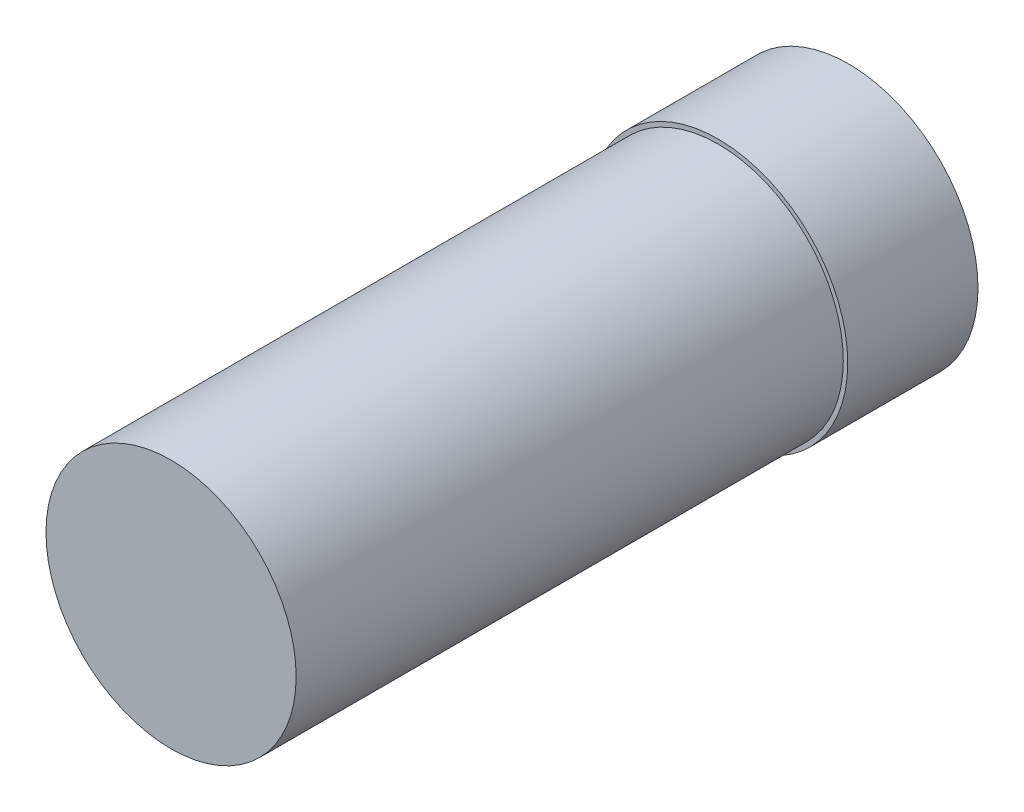
ISO-10303-21;
HEADER;
FILE_DESCRIPTION(('STEP AP214'),'2;1');
FILE_NAME('part.step','',(''),(''),'','','');
FILE_SCHEMA(('AUTOMOTIVE_DESIGN { 1 0 10303 214 1 1 1 1 }'));
ENDSEC;
DATA;
#1=APPLICATION_CONTEXT('core data for automotive mechanical design processes');
#2=APPLICATION_PROTOCOL_DEFINITION('international standard','automotive_design',2000,#1);
#3=PRODUCT_CONTEXT('',#1,'mechanical');
#4=PRODUCT('Part','Part','',(#3));
#5=PRODUCT_RELATED_PRODUCT_CATEGORY('part','',(#4));
#6=PRODUCT_DEFINITION_FORMATION('','',#4);
#7=PRODUCT_DEFINITION_CONTEXT('part definition',#1,'design');
#8=PRODUCT_DEFINITION('design','',#6,#7);
#9=PRODUCT_DEFINITION_SHAPE('','',#8);
#10=(LENGTH_UNIT() NAMED_UNIT(*) SI_UNIT(.MILLI.,.METRE.));
#11=(NAMED_UNIT(*) PLANE_ANGLE_UNIT() SI_UNIT($,.RADIAN.));
#12=(NAMED_UNIT(*) SI_UNIT($,.STERADIAN.) SOLID_ANGLE_UNIT());
#13=UNCERTAINTY_MEASURE_WITH_UNIT(LENGTH_MEASURE(1.E-05),#10,'distance_accuracy_value','');
#14=(GEOMETRIC_REPRESENTATION_CONTEXT(3) GLOBAL_UNCERTAINTY_ASSIGNED_CONTEXT((#13)) GLOBAL_UNIT_ASSIGNED_CONTEXT((#10,
#11,#12)) REPRESENTATION_CONTEXT('',''));
#15=CARTESIAN_POINT('',(0.,0.,0.));
#16=DIRECTION('',(0.,0.,1.));
#17=DIRECTION('',(1.,0.,0.));
#18=AXIS2_PLACEMENT_3D('',#15,#16,#17);
#19=CARTESIAN_POINT('',(0.,0.,2.5));
#20=DIRECTION('',(0.,0.,-1.));
#21=DIRECTION('',(-1.,0.,0.));
#22=AXIS2_PLACEMENT_3D('',#19,#20,#21);
#23=CYLINDRICAL_SURFACE('',#22,2.485);
#24=CARTESIAN_POINT('',(0.,0.,2.5));
#25=DIRECTION('',(0.,0.,1.));
#26=DIRECTION('',(1.,0.,0.));
#27=AXIS2_PLACEMENT_3D('',#24,#25,#26);
#28=CIRCLE('',#27,2.485);
#29=CARTESIAN_POINT('',(2.485,0.,2.5));
#30=VERTEX_POINT('',#29);
#31=EDGE_CURVE('E10',#30,#30,#28,.T.);
#32=ORIENTED_EDGE('',*,*,#31,.F.);
#33=EDGE_LOOP('',(#32));
#34=FACE_BOUND('',#33,.T.);
#35=CARTESIAN_POINT('',(0.,0.,0.));
#36=DIRECTION('',(0.,0.,1.));
#37=DIRECTION('',(1.,0.,0.));
#38=AXIS2_PLACEMENT_3D('',#35,#36,#37);
#39=CIRCLE('',#38,2.485);
#40=CARTESIAN_POINT('',(2.485,0.,0.));
#41=VERTEX_POINT('',#40);
#42=EDGE_CURVE('E34',#41,#41,#39,.T.);
#43=ORIENTED_EDGE('',*,*,#42,.T.);
#44=EDGE_LOOP('',(#43));
#45=FACE_BOUND('',#44,.T.);
#46=ADVANCED_FACE('F31',(#34,#45),#23,.T.);
#47=CARTESIAN_POINT('',(0.,0.,2.5));
#48=DIRECTION('',(0.,0.,1.));
#49=DIRECTION('',(1.,0.,0.));
#50=AXIS2_PLACEMENT_3D('',#47,#48,#49);
#51=PLANE('',#50);
#52=CARTESIAN_POINT('',(0.,0.,2.5));
#53=DIRECTION('',(0.,0.,1.));
#54=DIRECTION('',(1.,0.,0.));
#55=AXIS2_PLACEMENT_3D('',#52,#53,#54);
#56=CIRCLE('',#55,2.4);
#57=CARTESIAN_POINT('',(-2.4,0.,2.5));
#58=VERTEX_POINT('',#57);
#59=EDGE_CURVE('E43',#58,#58,#56,.T.);
#60=ORIENTED_EDGE('',*,*,#59,.F.);
#61=EDGE_LOOP('',(#60));
#62=FACE_BOUND('',#61,.T.);
#63=ORIENTED_EDGE('',*,*,#31,.T.);
#64=EDGE_LOOP('',(#63));
#65=FACE_BOUND('',#64,.T.);
#66=ADVANCED_FACE('F58',(#62,#65),#51,.T.);
#67=CARTESIAN_POINT('',(0.,0.,0.));
#68=DIRECTION('',(0.,0.,1.));
#69=DIRECTION('',(1.,0.,0.));
#70=AXIS2_PLACEMENT_3D('',#67,#68,#69);
#71=PLANE('',#70);
#72=ORIENTED_EDGE('',*,*,#42,.F.);
#73=EDGE_LOOP('',(#72));
#74=FACE_BOUND('',#73,.T.);
#75=ADVANCED_FACE('F54',(#74),#71,.F.);
#76=CARTESIAN_POINT('',(0.,0.,13.));
#77=DIRECTION('',(0.,0.,-1.));
#78=DIRECTION('',(-1.,0.,0.));
#79=AXIS2_PLACEMENT_3D('',#76,#77,#78);
#80=CYLINDRICAL_SURFACE('',#79,2.4);
#81=CARTESIAN_POINT('',(0.,0.,13.));
#82=DIRECTION('',(0.,0.,1.));
#83=DIRECTION('',(1.,0.,0.));
#84=AXIS2_PLACEMENT_3D('',#81,#82,#83);
#85=CIRCLE('',#84,2.4);
#86=CARTESIAN_POINT('',(-2.4,0.,13.));
#87=VERTEX_POINT('',#86);
#88=EDGE_CURVE('E41',#87,#87,#85,.T.);
#89=CARTESIAN_POINT('',(-2.4,0.,13.));
#90=CARTESIAN_POINT('',(-2.4,0.,12.890625));
#91=CARTESIAN_POINT('',(-2.4,0.,12.78125));
#92=CARTESIAN_POINT('',(-2.4,0.,12.5625));
#93=CARTESIAN_POINT('',(-2.4,0.,12.453125));
#94=CARTESIAN_POINT('',(-2.4,0.,12.234375));
#95=CARTESIAN_POINT('',(-2.4,0.,12.125));
#96=CARTESIAN_POINT('',(-2.4,0.,11.90625));
#97=CARTESIAN_POINT('',(-2.4,0.,11.796875));
#98=CARTESIAN_POINT('',(-2.4,0.,11.578125));
#99=CARTESIAN_POINT('',(-2.4,0.,11.46875));
#100=CARTESIAN_POINT('',(-2.4,0.,11.25));
#101=CARTESIAN_POINT('',(-2.4,0.,11.140625));
#102=CARTESIAN_POINT('',(-2.4,0.,10.921875));
#103=CARTESIAN_POINT('',(-2.4,0.,10.8125));
#104=CARTESIAN_POINT('',(-2.4,0.,10.59375));
#105=CARTESIAN_POINT('',(-2.4,0.,10.484375));
#106=CARTESIAN_POINT('',(-2.4,0.,10.265625));
#107=CARTESIAN_POINT('',(-2.4,0.,10.15625));
#108=CARTESIAN_POINT('',(-2.4,0.,9.9375));
#109=CARTESIAN_POINT('',(-2.4,0.,9.828125));
#110=CARTESIAN_POINT('',(-2.4,0.,9.609375));
#111=CARTESIAN_POINT('',(-2.4,0.,9.5));
#112=CARTESIAN_POINT('',(-2.4,0.,9.28125));
#113=CARTESIAN_POINT('',(-2.4,0.,9.171875));
#114=CARTESIAN_POINT('',(-2.4,0.,8.953125));
#115=CARTESIAN_POINT('',(-2.4,0.,8.84375));
#116=CARTESIAN_POINT('',(-2.4,0.,8.625));
#117=CARTESIAN_POINT('',(-2.4,0.,8.515625));
#118=CARTESIAN_POINT('',(-2.4,0.,8.296875));
#119=CARTESIAN_POINT('',(-2.4,0.,8.1875));
#120=CARTESIAN_POINT('',(-2.4,0.,7.96875));
#121=CARTESIAN_POINT('',(-2.4,0.,7.859375));
#122=CARTESIAN_POINT('',(-2.4,0.,7.640625));
#123=CARTESIAN_POINT('',(-2.4,0.,7.53125));
#124=CARTESIAN_POINT('',(-2.4,0.,7.3125));
#125=CARTESIAN_POINT('',(-2.4,0.,7.203125));
#126=CARTESIAN_POINT('',(-2.4,0.,6.984375));
#127=CARTESIAN_POINT('',(-2.4,0.,6.875));
#128=CARTESIAN_POINT('',(-2.4,0.,6.65625));
#129=CARTESIAN_POINT('',(-2.4,0.,6.546875));
#130=CARTESIAN_POINT('',(-2.4,0.,6.328125));
#131=CARTESIAN_POINT('',(-2.4,0.,6.21875));
#132=CARTESIAN_POINT('',(-2.4,0.,6.));
#133=CARTESIAN_POINT('',(-2.4,0.,5.890625));
#134=CARTESIAN_POINT('',(-2.4,0.,5.671875));
#135=CARTESIAN_POINT('',(-2.4,0.,5.5625));
#136=CARTESIAN_POINT('',(-2.4,0.,5.34375));
#137=CARTESIAN_POINT('',(-2.4,0.,5.234375));
#138=CARTESIAN_POINT('',(-2.4,0.,5.015625));
#139=CARTESIAN_POINT('',(-2.4,0.,4.90625));
#140=CARTESIAN_POINT('',(-2.4,0.,4.6875));
#141=CARTESIAN_POINT('',(-2.4,0.,4.578125));
#142=CARTESIAN_POINT('',(-2.4,0.,4.359375));
#143=CARTESIAN_POINT('',(-2.4,0.,4.25));
#144=CARTESIAN_POINT('',(-2.4,0.,4.03125));
#145=CARTESIAN_POINT('',(-2.4,0.,3.921875));
#146=CARTESIAN_POINT('',(-2.4,0.,3.703125));
#147=CARTESIAN_POINT('',(-2.4,0.,3.59375));
#148=CARTESIAN_POINT('',(-2.4,0.,3.375));
#149=CARTESIAN_POINT('',(-2.4,0.,3.265625));
#150=CARTESIAN_POINT('',(-2.4,0.,3.046875));
#151=CARTESIAN_POINT('',(-2.4,0.,2.9375));
#152=CARTESIAN_POINT('',(-2.4,0.,2.71875));
#153=CARTESIAN_POINT('',(-2.4,0.,2.609375));
#154=CARTESIAN_POINT('',(-2.4,0.,2.5));
#155=B_SPLINE_CURVE_WITH_KNOTS('',3,(#89,#90,#91,#92,#93,#94,#95,#96,#97,#98,#99,#100,#101,#102,
#103,#104,#105,#106,#107,#108,#109,#110,#111,#112,#113,#114,#115,#116,#117,#118,#119,#120,#121,
#122,#123,#124,#125,#126,#127,#128,#129,#130,#131,#132,#133,#134,#135,#136,#137,#138,#139,#140,
#141,#142,#143,#144,#145,#146,#147,#148,#149,#150,#151,#152,#153,#154),.UNSPECIFIED.,.F.,.F.,(4,
2,2,2,2,2,2,2,2,2,2,2,2,2,2,2,2,2,2,2,2,2,2,2,2,2,2,2,2,2,2,2,4),(0.,0.328124999999999,
0.656249999999999,0.984374999999999,1.3125,1.640625,1.96875,2.296875,2.625,2.953125,3.28125,
3.609375,3.9375,4.265625,4.59375,4.921875,5.25,5.578125,5.90625,6.234375,6.5625,6.890625,
7.21875,7.546875,7.875,8.203125,8.53125,8.859375,9.1875,9.515625,9.84375,10.171875,10.5),.UNSPECIFIED.);
#156=EDGE_CURVE('BSEAM51',#87,#58,#155,.T.);
#157=ORIENTED_EDGE('',*,*,#88,.F.);
#158=ORIENTED_EDGE('',*,*,#59,.T.);
#159=ORIENTED_EDGE('',*,*,#156,.T.);
#160=ORIENTED_EDGE('',*,*,#156,.F.);
#161=EDGE_LOOP('',(#157,#159,#158,#160));
#162=FACE_BOUND('',#161,.T.);
#163=ADVANCED_FACE('F51',(#162),#80,.T.);
#164=CARTESIAN_POINT('',(0.,0.,13.));
#165=DIRECTION('',(0.,0.,1.));
#166=DIRECTION('',(1.,0.,0.));
#167=AXIS2_PLACEMENT_3D('',#164,#165,#166);
#168=PLANE('',#167);
#169=ORIENTED_EDGE('',*,*,#88,.T.);
#170=EDGE_LOOP('',(#169));
#171=FACE_BOUND('',#170,.T.);
#172=ADVANCED_FACE('F49',(#171),#168,.T.);
#173=CLOSED_SHELL('',(#46,#66,#75,#163,#172));
#174=MANIFOLD_SOLID_BREP('B2',#173);
#175=ADVANCED_BREP_SHAPE_REPRESENTATION('',(#18,#174),#14);
#176=SHAPE_DEFINITION_REPRESENTATION(#9,#175);
ENDSEC;
END-ISO-10303-21;
